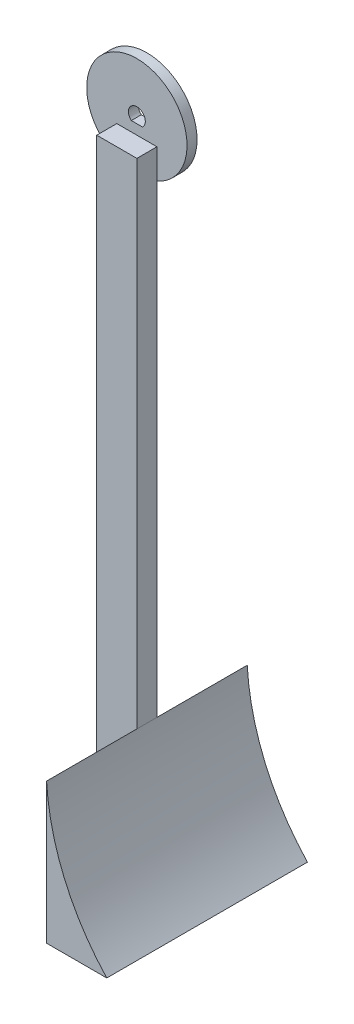
ISO-10303-21;
HEADER;
FILE_DESCRIPTION(('STEP AP214'),'2;1');
FILE_NAME('part.step','',(''),(''),'','','');
FILE_SCHEMA(('AUTOMOTIVE_DESIGN { 1 0 10303 214 1 1 1 1 }'));
ENDSEC;
DATA;
#1=APPLICATION_CONTEXT('core data for automotive mechanical design processes');
#2=APPLICATION_PROTOCOL_DEFINITION('international standard','automotive_design',2000,#1);
#3=PRODUCT_CONTEXT('',#1,'mechanical');
#4=PRODUCT('Part','Part','',(#3));
#5=PRODUCT_RELATED_PRODUCT_CATEGORY('part','',(#4));
#6=PRODUCT_DEFINITION_FORMATION('','',#4);
#7=PRODUCT_DEFINITION_CONTEXT('part definition',#1,'design');
#8=PRODUCT_DEFINITION('design','',#6,#7);
#9=PRODUCT_DEFINITION_SHAPE('','',#8);
#10=(LENGTH_UNIT() NAMED_UNIT(*) SI_UNIT(.MILLI.,.METRE.));
#11=(NAMED_UNIT(*) PLANE_ANGLE_UNIT() SI_UNIT($,.RADIAN.));
#12=(NAMED_UNIT(*) SI_UNIT($,.STERADIAN.) SOLID_ANGLE_UNIT());
#13=UNCERTAINTY_MEASURE_WITH_UNIT(LENGTH_MEASURE(1.E-05),#10,'distance_accuracy_value','');
#14=(GEOMETRIC_REPRESENTATION_CONTEXT(3) GLOBAL_UNCERTAINTY_ASSIGNED_CONTEXT((#13)) GLOBAL_UNIT_ASSIGNED_CONTEXT((#10,
#11,#12)) REPRESENTATION_CONTEXT('',''));
#15=CARTESIAN_POINT('',(0.,0.,0.));
#16=DIRECTION('',(0.,0.,1.));
#17=DIRECTION('',(1.,0.,0.));
#18=AXIS2_PLACEMENT_3D('',#15,#16,#17);
#19=CARTESIAN_POINT('',(0.,0.,2.5));
#20=DIRECTION('',(0.,0.,-1.));
#21=DIRECTION('',(-1.,0.,0.));
#22=AXIS2_PLACEMENT_3D('',#19,#20,#21);
#23=CYLINDRICAL_SURFACE('',#22,2.1);
#24=CARTESIAN_POINT('',(0.,0.,0.));
#25=DIRECTION('',(0.,0.,1.));
#26=DIRECTION('',(1.,0.,0.));
#27=AXIS2_PLACEMENT_3D('',#24,#25,#26);
#28=CIRCLE('',#27,2.1);
#29=CARTESIAN_POINT('',(1.38901943830891,-1.575,0.));
#30=VERTEX_POINT('',#29);
#31=CARTESIAN_POINT('',(-1.38901943830891,-1.575,0.));
#32=VERTEX_POINT('',#31);
#33=EDGE_CURVE('E163',#30,#32,#28,.T.);
#34=ORIENTED_EDGE('',*,*,#33,.F.);
#35=DIRECTION('',(0.,0.,-1.));
#36=VECTOR('',#35,1.);
#37=CARTESIAN_POINT('',(1.38901943830891,-1.575,2.5));
#38=LINE('',#37,#36);
#39=CARTESIAN_POINT('',(1.38901943830891,-1.575,2.5));
#40=VERTEX_POINT('',#39);
#41=EDGE_CURVE('E59',#40,#30,#38,.T.);
#42=ORIENTED_EDGE('',*,*,#41,.F.);
#43=CARTESIAN_POINT('',(0.,0.,2.5));
#44=DIRECTION('',(0.,0.,1.));
#45=DIRECTION('',(1.,0.,0.));
#46=AXIS2_PLACEMENT_3D('',#43,#44,#45);
#47=CIRCLE('',#46,2.1);
#48=CARTESIAN_POINT('',(-1.38901943830891,-1.575,2.5));
#49=VERTEX_POINT('',#48);
#50=EDGE_CURVE('E193',#40,#49,#47,.T.);
#51=ORIENTED_EDGE('',*,*,#50,.T.);
#52=DIRECTION('',(0.,0.,-1.));
#53=VECTOR('',#52,1.);
#54=CARTESIAN_POINT('',(-1.38901943830891,-1.575,2.5));
#55=LINE('',#54,#53);
#56=EDGE_CURVE('E206',#49,#32,#55,.T.);
#57=ORIENTED_EDGE('',*,*,#56,.T.);
#58=EDGE_LOOP('',(#34,#42,#51,#57));
#59=FACE_BOUND('',#58,.T.);
#60=ADVANCED_FACE('F49',(#59),#23,.F.);
#61=CARTESIAN_POINT('',(0.,-1.575,2.5));
#62=DIRECTION('',(0.,1.,0.));
#63=DIRECTION('',(-1.,0.,0.));
#64=AXIS2_PLACEMENT_3D('',#61,#62,#63);
#65=PLANE('',#64);
#66=DIRECTION('',(1.,0.,0.));
#67=VECTOR('',#66,1.);
#68=CARTESIAN_POINT('',(0.,-1.575,0.));
#69=LINE('',#68,#67);
#70=EDGE_CURVE('E210',#32,#30,#69,.T.);
#71=ORIENTED_EDGE('',*,*,#70,.F.);
#72=ORIENTED_EDGE('',*,*,#56,.F.);
#73=DIRECTION('',(1.,0.,0.));
#74=VECTOR('',#73,1.);
#75=CARTESIAN_POINT('',(0.,-1.575,2.5));
#76=LINE('',#75,#74);
#77=EDGE_CURVE('E197',#49,#40,#76,.T.);
#78=ORIENTED_EDGE('',*,*,#77,.T.);
#79=ORIENTED_EDGE('',*,*,#41,.T.);
#80=EDGE_LOOP('',(#71,#72,#78,#79));
#81=FACE_BOUND('',#80,.T.);
#82=ADVANCED_FACE('F278',(#81),#65,.T.);
#83=CARTESIAN_POINT('',(0.,0.,2.5));
#84=DIRECTION('',(0.,0.,-1.));
#85=DIRECTION('',(-1.,0.,0.));
#86=AXIS2_PLACEMENT_3D('',#83,#84,#85);
#87=CYLINDRICAL_SURFACE('',#86,12.5);
#88=CARTESIAN_POINT('',(0.,0.,2.5));
#89=DIRECTION('',(0.,0.,1.));
#90=DIRECTION('',(1.,0.,0.));
#91=AXIS2_PLACEMENT_3D('',#88,#89,#90);
#92=CIRCLE('',#91,12.5);
#93=CARTESIAN_POINT('',(-5.,-11.4564392373896,2.5));
#94=VERTEX_POINT('',#93);
#95=CARTESIAN_POINT('',(5.00000000000002,-11.4564392373896,2.5));
#96=VERTEX_POINT('',#95);
#97=EDGE_CURVE('E202',#94,#96,#92,.T.);
#98=ORIENTED_EDGE('',*,*,#97,.F.);
#99=EDGE_CURVE('E147',#96,#94,#92,.T.);
#100=ORIENTED_EDGE('',*,*,#99,.F.);
#101=EDGE_LOOP('',(#98,#100));
#102=FACE_BOUND('',#101,.T.);
#103=CARTESIAN_POINT('',(0.,0.,0.));
#104=DIRECTION('',(0.,0.,1.));
#105=DIRECTION('',(1.,0.,0.));
#106=AXIS2_PLACEMENT_3D('',#103,#104,#105);
#107=CIRCLE('',#106,12.5);
#108=CARTESIAN_POINT('',(12.5,0.,0.));
#109=VERTEX_POINT('',#108);
#110=EDGE_CURVE('E198',#109,#109,#107,.T.);
#111=ORIENTED_EDGE('',*,*,#110,.T.);
#112=EDGE_LOOP('',(#111));
#113=FACE_BOUND('',#112,.T.);
#114=ADVANCED_FACE('F283',(#102,#113),#87,.T.);
#115=CARTESIAN_POINT('',(0.,0.,2.5));
#116=DIRECTION('',(0.,0.,1.));
#117=DIRECTION('',(1.,0.,0.));
#118=AXIS2_PLACEMENT_3D('',#115,#116,#117);
#119=PLANE('',#118);
#120=DIRECTION('',(0.,1.,0.));
#121=VECTOR('',#120,1.);
#122=CARTESIAN_POINT('',(5.00000000000002,0.,2.5));
#123=LINE('',#122,#121);
#124=CARTESIAN_POINT('',(5.00000000000002,-4.03831671183721,2.5));
#125=VERTEX_POINT('',#124);
#126=EDGE_CURVE('E11',#96,#125,#123,.T.);
#127=ORIENTED_EDGE('',*,*,#126,.F.);
#128=ORIENTED_EDGE('',*,*,#99,.T.);
#129=DIRECTION('',(0.,-1.,0.));
#130=VECTOR('',#129,1.);
#131=CARTESIAN_POINT('',(-5.,0.,2.5));
#132=LINE('',#131,#130);
#133=CARTESIAN_POINT('',(-5.,-4.03831671183721,2.5));
#134=VERTEX_POINT('',#133);
#135=EDGE_CURVE('E139',#134,#94,#132,.T.);
#136=ORIENTED_EDGE('',*,*,#135,.F.);
#137=DIRECTION('',(1.,0.,0.));
#138=VECTOR('',#137,1.);
#139=CARTESIAN_POINT('',(0.,-4.03831671183721,2.5));
#140=LINE('',#139,#138);
#141=EDGE_CURVE('E145',#134,#125,#140,.T.);
#142=ORIENTED_EDGE('',*,*,#141,.T.);
#143=EDGE_LOOP('',(#127,#128,#136,#142));
#144=FACE_BOUND('',#143,.T.);
#145=ORIENTED_EDGE('',*,*,#50,.F.);
#146=ORIENTED_EDGE('',*,*,#77,.F.);
#147=EDGE_LOOP('',(#145,#146));
#148=FACE_BOUND('',#147,.T.);
#149=ADVANCED_FACE('F142',(#144,#148),#119,.T.);
#150=CARTESIAN_POINT('',(0.,0.,0.));
#151=DIRECTION('',(0.,0.,1.));
#152=DIRECTION('',(1.,0.,0.));
#153=AXIS2_PLACEMENT_3D('',#150,#151,#152);
#154=PLANE('',#153);
#155=ORIENTED_EDGE('',*,*,#33,.T.);
#156=ORIENTED_EDGE('',*,*,#70,.T.);
#157=EDGE_LOOP('',(#155,#156));
#158=FACE_BOUND('',#157,.T.);
#159=ORIENTED_EDGE('',*,*,#110,.F.);
#160=EDGE_LOOP('',(#159));
#161=FACE_BOUND('',#160,.T.);
#162=ADVANCED_FACE('F289',(#158,#161),#154,.F.);
#163=CARTESIAN_POINT('',(0.,0.,2.5));
#164=DIRECTION('',(0.,0.,1.));
#165=DIRECTION('',(1.,0.,0.));
#166=AXIS2_PLACEMENT_3D('',#163,#164,#165);
#167=PLANE('',#166);
#168=CARTESIAN_POINT('',(-5.,-162.170582252729,2.5));
#169=VERTEX_POINT('',#168);
#170=EDGE_CURVE('E152',#94,#169,#132,.T.);
#171=ORIENTED_EDGE('',*,*,#170,.F.);
#172=ORIENTED_EDGE('',*,*,#97,.T.);
#173=CARTESIAN_POINT('',(5.00000000000004,-127.170582252729,2.5));
#174=VERTEX_POINT('',#173);
#175=EDGE_CURVE('E62',#174,#96,#123,.T.);
#176=ORIENTED_EDGE('',*,*,#175,.F.);
#177=CARTESIAN_POINT('',(5.00000000000004,-162.170582252729,2.5));
#178=VERTEX_POINT('',#177);
#179=EDGE_CURVE('E61',#178,#174,#123,.T.);
#180=ORIENTED_EDGE('',*,*,#179,.F.);
#181=DIRECTION('',(1.,0.,0.));
#182=VECTOR('',#181,1.);
#183=CARTESIAN_POINT('',(0.,-162.170582252729,2.5));
#184=LINE('',#183,#182);
#185=EDGE_CURVE('E151',#169,#178,#184,.T.);
#186=ORIENTED_EDGE('',*,*,#185,.F.);
#187=EDGE_LOOP('',(#171,#172,#176,#180,#186));
#188=FACE_BOUND('',#187,.T.);
#189=ADVANCED_FACE('F299',(#188),#167,.F.);
#190=CARTESIAN_POINT('',(0.,-4.03831671183721,7.5));
#191=DIRECTION('',(0.,1.,0.));
#192=DIRECTION('',(0.,0.,1.));
#193=AXIS2_PLACEMENT_3D('',#190,#191,#192);
#194=PLANE('',#193);
#195=ORIENTED_EDGE('',*,*,#141,.F.);
#196=DIRECTION('',(0.,0.,-1.));
#197=VECTOR('',#196,1.);
#198=CARTESIAN_POINT('',(-5.,-4.03831671183721,7.5));
#199=LINE('',#198,#197);
#200=CARTESIAN_POINT('',(-5.,-4.03831671183721,7.5));
#201=VERTEX_POINT('',#200);
#202=EDGE_CURVE('E155',#201,#134,#199,.T.);
#203=ORIENTED_EDGE('',*,*,#202,.F.);
#204=DIRECTION('',(1.,0.,0.));
#205=VECTOR('',#204,1.);
#206=CARTESIAN_POINT('',(0.,-4.03831671183721,7.5));
#207=LINE('',#206,#205);
#208=CARTESIAN_POINT('',(5.00000000000002,-4.03831671183721,7.5));
#209=VERTEX_POINT('',#208);
#210=EDGE_CURVE('E187',#201,#209,#207,.T.);
#211=ORIENTED_EDGE('',*,*,#210,.T.);
#212=DIRECTION('',(0.,0.,-1.));
#213=VECTOR('',#212,1.);
#214=CARTESIAN_POINT('',(5.00000000000002,-4.03831671183721,7.5));
#215=LINE('',#214,#213);
#216=EDGE_CURVE('E169',#209,#125,#215,.T.);
#217=ORIENTED_EDGE('',*,*,#216,.T.);
#218=EDGE_LOOP('',(#195,#203,#211,#217));
#219=FACE_BOUND('',#218,.T.);
#220=ADVANCED_FACE('F167',(#219),#194,.T.);
#221=CARTESIAN_POINT('',(-5.,0.,7.5));
#222=DIRECTION('',(1.,0.,0.));
#223=DIRECTION('',(0.,0.,-1.));
#224=AXIS2_PLACEMENT_3D('',#221,#222,#223);
#225=PLANE('',#224);
#226=ORIENTED_EDGE('',*,*,#135,.T.);
#227=ORIENTED_EDGE('',*,*,#170,.T.);
#228=DIRECTION('',(0.,0.,-1.));
#229=VECTOR('',#228,1.);
#230=CARTESIAN_POINT('',(-5.,-162.170582252729,7.5));
#231=LINE('',#230,#229);
#232=CARTESIAN_POINT('',(-5.,-162.170582252729,7.5));
#233=VERTEX_POINT('',#232);
#234=EDGE_CURVE('E164',#233,#169,#231,.T.);
#235=ORIENTED_EDGE('',*,*,#234,.F.);
#236=DIRECTION('',(0.,-1.,0.));
#237=VECTOR('',#236,1.);
#238=CARTESIAN_POINT('',(-5.,0.,7.5));
#239=LINE('',#238,#237);
#240=EDGE_CURVE('E158',#201,#233,#239,.T.);
#241=ORIENTED_EDGE('',*,*,#240,.F.);
#242=ORIENTED_EDGE('',*,*,#202,.T.);
#243=EDGE_LOOP('',(#226,#227,#235,#241,#242));
#244=FACE_BOUND('',#243,.T.);
#245=ADVANCED_FACE('F156',(#244),#225,.F.);
#246=CARTESIAN_POINT('',(0.,-162.170582252729,7.5));
#247=DIRECTION('',(0.,1.,0.));
#248=DIRECTION('',(0.,0.,1.));
#249=AXIS2_PLACEMENT_3D('',#246,#247,#248);
#250=PLANE('',#249);
#251=ORIENTED_EDGE('',*,*,#185,.T.);
#252=DIRECTION('',(0.,0.,-1.));
#253=VECTOR('',#252,1.);
#254=CARTESIAN_POINT('',(5.00000000000004,-162.170582252729,0.));
#255=LINE('',#254,#253);
#256=CARTESIAN_POINT('',(5.00000000000004,-162.170582252729,-20.));
#257=VERTEX_POINT('',#256);
#258=EDGE_CURVE('E233',#178,#257,#255,.T.);
#259=ORIENTED_EDGE('',*,*,#258,.T.);
#260=DIRECTION('',(-1.,0.,0.));
#261=VECTOR('',#260,1.);
#262=CARTESIAN_POINT('',(20.,-162.170582252729,-20.));
#263=LINE('',#262,#261);
#264=CARTESIAN_POINT('',(20.,-162.170582252729,-20.));
#265=VERTEX_POINT('',#264);
#266=EDGE_CURVE('E176',#265,#257,#263,.T.);
#267=ORIENTED_EDGE('',*,*,#266,.F.);
#268=DIRECTION('',(0.,0.,-1.));
#269=VECTOR('',#268,1.);
#270=CARTESIAN_POINT('',(20.,-162.170582252729,0.));
#271=LINE('',#270,#269);
#272=CARTESIAN_POINT('',(20.,-162.170582252729,30.));
#273=VERTEX_POINT('',#272);
#274=EDGE_CURVE('E81',#273,#265,#271,.T.);
#275=ORIENTED_EDGE('',*,*,#274,.F.);
#276=DIRECTION('',(-1.,0.,0.));
#277=VECTOR('',#276,1.);
#278=CARTESIAN_POINT('',(20.,-162.170582252729,30.));
#279=LINE('',#278,#277);
#280=CARTESIAN_POINT('',(5.00000000000004,-162.170582252729,30.));
#281=VERTEX_POINT('',#280);
#282=EDGE_CURVE('E171',#273,#281,#279,.T.);
#283=ORIENTED_EDGE('',*,*,#282,.T.);
#284=CARTESIAN_POINT('',(5.00000000000004,-162.170582252729,7.5));
#285=VERTEX_POINT('',#284);
#286=EDGE_CURVE('E228',#281,#285,#255,.T.);
#287=ORIENTED_EDGE('',*,*,#286,.T.);
#288=DIRECTION('',(1.,0.,0.));
#289=VECTOR('',#288,1.);
#290=CARTESIAN_POINT('',(0.,-162.170582252729,7.5));
#291=LINE('',#290,#289);
#292=EDGE_CURVE('E247',#233,#285,#291,.T.);
#293=ORIENTED_EDGE('',*,*,#292,.F.);
#294=ORIENTED_EDGE('',*,*,#234,.T.);
#295=EDGE_LOOP('',(#251,#259,#267,#275,#283,#287,#293,#294));
#296=FACE_BOUND('',#295,.T.);
#297=ADVANCED_FACE('F266',(#296),#250,.F.);
#298=CARTESIAN_POINT('',(5.00000000000002,0.,7.5));
#299=DIRECTION('',(-1.,0.,0.));
#300=DIRECTION('',(0.,-1.,0.));
#301=AXIS2_PLACEMENT_3D('',#298,#299,#300);
#302=PLANE('',#301);
#303=DIRECTION('',(0.,1.,0.));
#304=VECTOR('',#303,1.);
#305=CARTESIAN_POINT('',(5.00000000000002,0.,7.5));
#306=LINE('',#305,#304);
#307=CARTESIAN_POINT('',(5.00000000000002,-127.170582252729,7.5));
#308=VERTEX_POINT('',#307);
#309=EDGE_CURVE('E249',#308,#209,#306,.T.);
#310=ORIENTED_EDGE('',*,*,#309,.F.);
#311=DIRECTION('',(0.,0.,-1.));
#312=VECTOR('',#311,1.);
#313=CARTESIAN_POINT('',(5.00000000000004,-127.170582252729,0.));
#314=LINE('',#313,#312);
#315=EDGE_CURVE('E70',#308,#174,#314,.T.);
#316=ORIENTED_EDGE('',*,*,#315,.T.);
#317=ORIENTED_EDGE('',*,*,#175,.T.);
#318=ORIENTED_EDGE('',*,*,#126,.T.);
#319=ORIENTED_EDGE('',*,*,#216,.F.);
#320=EDGE_LOOP('',(#310,#316,#317,#318,#319));
#321=FACE_BOUND('',#320,.T.);
#322=ADVANCED_FACE('F263',(#321),#302,.F.);
#323=CARTESIAN_POINT('',(0.,0.,7.5));
#324=DIRECTION('',(0.,0.,1.));
#325=DIRECTION('',(1.,0.,0.));
#326=AXIS2_PLACEMENT_3D('',#323,#324,#325);
#327=PLANE('',#326);
#328=ORIENTED_EDGE('',*,*,#210,.F.);
#329=ORIENTED_EDGE('',*,*,#240,.T.);
#330=ORIENTED_EDGE('',*,*,#292,.T.);
#331=EDGE_CURVE('E179',#285,#308,#306,.T.);
#332=ORIENTED_EDGE('',*,*,#331,.T.);
#333=ORIENTED_EDGE('',*,*,#309,.T.);
#334=EDGE_LOOP('',(#328,#329,#330,#332,#333));
#335=FACE_BOUND('',#334,.T.);
#336=ADVANCED_FACE('F255',(#335),#327,.T.);
#337=CARTESIAN_POINT('',(5.00000000000002,0.,0.));
#338=DIRECTION('',(1.,0.,0.));
#339=DIRECTION('',(0.,1.,0.));
#340=AXIS2_PLACEMENT_3D('',#337,#338,#339);
#341=PLANE('',#340);
#342=ORIENTED_EDGE('',*,*,#258,.F.);
#343=ORIENTED_EDGE('',*,*,#179,.T.);
#344=CARTESIAN_POINT('',(5.00000000000003,-127.170582252729,-20.));
#345=VERTEX_POINT('',#344);
#346=EDGE_CURVE('E261',#174,#345,#314,.T.);
#347=ORIENTED_EDGE('',*,*,#346,.T.);
#348=DIRECTION('',(0.,-1.,0.));
#349=VECTOR('',#348,1.);
#350=CARTESIAN_POINT('',(5.00000000000002,0.,-20.));
#351=LINE('',#350,#349);
#352=EDGE_CURVE('E223',#345,#257,#351,.T.);
#353=ORIENTED_EDGE('',*,*,#352,.T.);
#354=EDGE_LOOP('',(#342,#343,#347,#353));
#355=FACE_BOUND('',#354,.T.);
#356=ADVANCED_FACE('F313',(#355),#341,.F.);
#357=CARTESIAN_POINT('',(20.,0.,30.));
#358=DIRECTION('',(0.,0.,-1.));
#359=DIRECTION('',(0.,1.,0.));
#360=AXIS2_PLACEMENT_3D('',#357,#358,#359);
#361=PLANE('',#360);
#362=ORIENTED_EDGE('',*,*,#282,.F.);
#363=CARTESIAN_POINT('',(60.9881751462692,-123.889935761471,30.));
#364=DIRECTION('',(0.,0.,-1.));
#365=DIRECTION('',(0.,-1.,0.));
#366=AXIS2_PLACEMENT_3D('',#363,#364,#365);
#367=CIRCLE('',#366,56.0842080947027);
#368=CARTESIAN_POINT('',(5.00000000000004,-127.170582252729,30.));
#369=VERTEX_POINT('',#368);
#370=EDGE_CURVE('E88',#273,#369,#367,.T.);
#371=ORIENTED_EDGE('',*,*,#370,.T.);
#372=DIRECTION('',(0.,-1.,0.));
#373=VECTOR('',#372,1.);
#374=CARTESIAN_POINT('',(5.00000000000002,0.,30.));
#375=LINE('',#374,#373);
#376=EDGE_CURVE('E240',#369,#281,#375,.T.);
#377=ORIENTED_EDGE('',*,*,#376,.T.);
#378=EDGE_LOOP('',(#362,#371,#377));
#379=FACE_BOUND('',#378,.T.);
#380=ADVANCED_FACE('F314',(#379),#361,.F.);
#381=CARTESIAN_POINT('',(20.,0.,-20.));
#382=DIRECTION('',(0.,0.,-1.));
#383=DIRECTION('',(0.,1.,0.));
#384=AXIS2_PLACEMENT_3D('',#381,#382,#383);
#385=PLANE('',#384);
#386=CARTESIAN_POINT('',(60.9881751462692,-123.889935761471,-20.));
#387=DIRECTION('',(0.,0.,-1.));
#388=DIRECTION('',(0.,1.,0.));
#389=AXIS2_PLACEMENT_3D('',#386,#387,#388);
#390=CIRCLE('',#389,56.0842080947027);
#391=EDGE_CURVE('E52',#265,#345,#390,.T.);
#392=ORIENTED_EDGE('',*,*,#391,.F.);
#393=ORIENTED_EDGE('',*,*,#266,.T.);
#394=ORIENTED_EDGE('',*,*,#352,.F.);
#395=EDGE_LOOP('',(#392,#393,#394));
#396=FACE_BOUND('',#395,.T.);
#397=ADVANCED_FACE('F317',(#396),#385,.T.);
#398=ORIENTED_EDGE('',*,*,#331,.F.);
#399=ORIENTED_EDGE('',*,*,#286,.F.);
#400=ORIENTED_EDGE('',*,*,#376,.F.);
#401=EDGE_CURVE('E259',#369,#308,#314,.T.);
#402=ORIENTED_EDGE('',*,*,#401,.T.);
#403=EDGE_LOOP('',(#398,#399,#400,#402));
#404=FACE_BOUND('',#403,.T.);
#405=ADVANCED_FACE('F257',(#404),#341,.F.);
#406=CARTESIAN_POINT('',(60.9881751462692,-123.889935761471,30.));
#407=DIRECTION('',(0.,0.,-1.));
#408=DIRECTION('',(0.,1.,0.));
#409=AXIS2_PLACEMENT_3D('',#406,#407,#408);
#410=CYLINDRICAL_SURFACE('',#409,56.0842080947027);
#411=ORIENTED_EDGE('',*,*,#391,.T.);
#412=ORIENTED_EDGE('',*,*,#346,.F.);
#413=ORIENTED_EDGE('',*,*,#315,.F.);
#414=ORIENTED_EDGE('',*,*,#401,.F.);
#415=ORIENTED_EDGE('',*,*,#370,.F.);
#416=ORIENTED_EDGE('',*,*,#274,.T.);
#417=EDGE_LOOP('',(#411,#412,#413,#414,#415,#416));
#418=FACE_BOUND('',#417,.T.);
#419=ADVANCED_FACE('F324',(#418),#410,.F.);
#420=CLOSED_SHELL('',(#60,#82,#114,#149,#162,#189,#220,#245,#297,#322,#336,#356,#380,#397,#405,#419));
#421=MANIFOLD_SOLID_BREP('B2',#420);
#422=ADVANCED_BREP_SHAPE_REPRESENTATION('',(#18,#421),#14);
#423=SHAPE_DEFINITION_REPRESENTATION(#9,#422);
ENDSEC;
END-ISO-10303-21;
